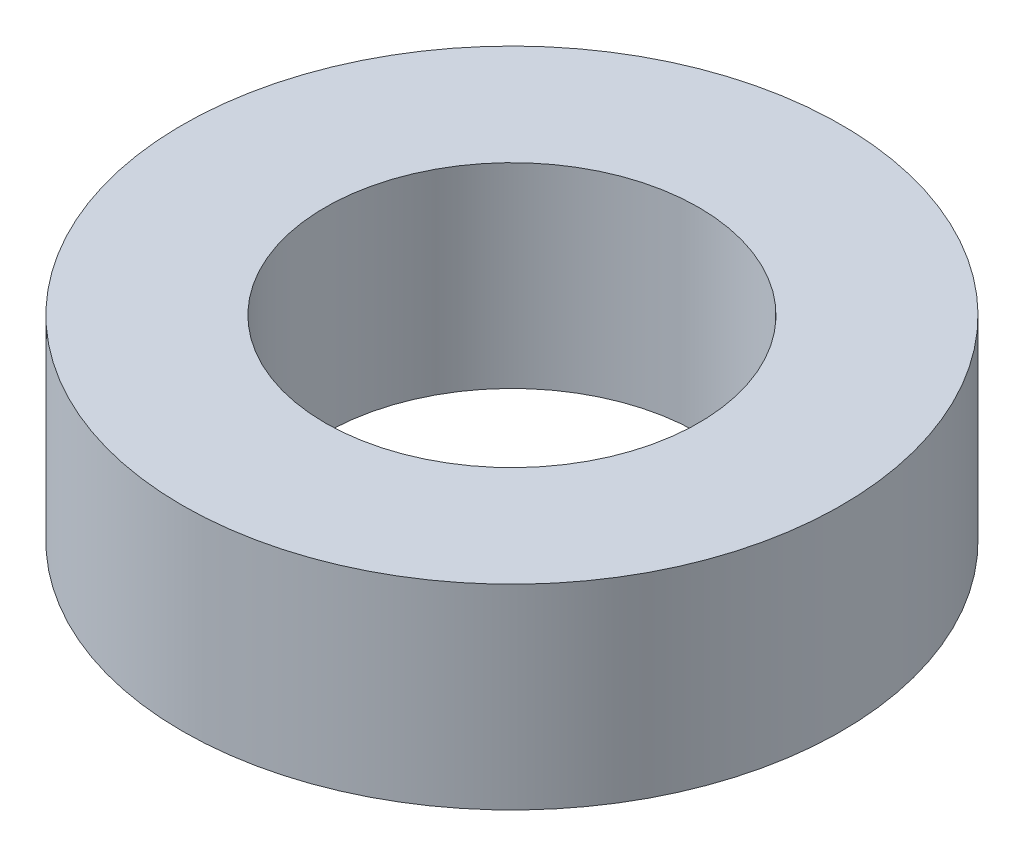
ISO-10303-21;
HEADER;
FILE_DESCRIPTION(('STEP AP214'),'2;1');
FILE_NAME('part.step','',(''),(''),'','','');
FILE_SCHEMA(('AUTOMOTIVE_DESIGN { 1 0 10303 214 1 1 1 1 }'));
ENDSEC;
DATA;
#1=APPLICATION_CONTEXT('core data for automotive mechanical design processes');
#2=APPLICATION_PROTOCOL_DEFINITION('international standard','automotive_design',2000,#1);
#3=PRODUCT_CONTEXT('',#1,'mechanical');
#4=PRODUCT('Part','Part','',(#3));
#5=PRODUCT_RELATED_PRODUCT_CATEGORY('part','',(#4));
#6=PRODUCT_DEFINITION_FORMATION('','',#4);
#7=PRODUCT_DEFINITION_CONTEXT('part definition',#1,'design');
#8=PRODUCT_DEFINITION('design','',#6,#7);
#9=PRODUCT_DEFINITION_SHAPE('','',#8);
#10=(LENGTH_UNIT() NAMED_UNIT(*) SI_UNIT(.MILLI.,.METRE.));
#11=(NAMED_UNIT(*) PLANE_ANGLE_UNIT() SI_UNIT($,.RADIAN.));
#12=(NAMED_UNIT(*) SI_UNIT($,.STERADIAN.) SOLID_ANGLE_UNIT());
#13=UNCERTAINTY_MEASURE_WITH_UNIT(LENGTH_MEASURE(1.E-05),#10,'distance_accuracy_value','');
#14=(GEOMETRIC_REPRESENTATION_CONTEXT(3) GLOBAL_UNCERTAINTY_ASSIGNED_CONTEXT((#13)) GLOBAL_UNIT_ASSIGNED_CONTEXT((#10,
#11,#12)) REPRESENTATION_CONTEXT('',''));
#15=CARTESIAN_POINT('',(0.,0.,0.));
#16=DIRECTION('',(0.,0.,1.));
#17=DIRECTION('',(1.,0.,0.));
#18=AXIS2_PLACEMENT_3D('',#15,#16,#17);
#19=CARTESIAN_POINT('',(0.,8.9,0.));
#20=DIRECTION('',(0.,1.,0.));
#21=DIRECTION('',(0.,0.,1.));
#22=AXIS2_PLACEMENT_3D('',#19,#20,#21);
#23=PLANE('',#22);
#24=CARTESIAN_POINT('',(0.,8.9,0.));
#25=DIRECTION('',(0.,1.,0.));
#26=DIRECTION('',(0.,0.,1.));
#27=AXIS2_PLACEMENT_3D('',#24,#25,#26);
#28=CIRCLE('',#27,15.);
#29=CARTESIAN_POINT('',(0.,8.9,15.));
#30=VERTEX_POINT('',#29);
#31=EDGE_CURVE('E10',#30,#30,#28,.T.);
#32=ORIENTED_EDGE('',*,*,#31,.T.);
#33=EDGE_LOOP('',(#32));
#34=FACE_BOUND('',#33,.T.);
#35=CARTESIAN_POINT('',(0.,8.9,0.));
#36=DIRECTION('',(0.,1.,0.));
#37=DIRECTION('',(0.,0.,1.));
#38=AXIS2_PLACEMENT_3D('',#35,#36,#37);
#39=CIRCLE('',#38,8.5);
#40=CARTESIAN_POINT('',(0.,8.9,8.5));
#41=VERTEX_POINT('',#40);
#42=EDGE_CURVE('E40',#41,#41,#39,.T.);
#43=ORIENTED_EDGE('',*,*,#42,.F.);
#44=EDGE_LOOP('',(#43));
#45=FACE_BOUND('',#44,.T.);
#46=ADVANCED_FACE('F29',(#34,#45),#23,.T.);
#47=CARTESIAN_POINT('',(0.,0.,0.));
#48=DIRECTION('',(0.,1.,0.));
#49=DIRECTION('',(0.,0.,1.));
#50=AXIS2_PLACEMENT_3D('',#47,#48,#49);
#51=PLANE('',#50);
#52=CARTESIAN_POINT('',(0.,0.,0.));
#53=DIRECTION('',(0.,1.,0.));
#54=DIRECTION('',(0.,0.,1.));
#55=AXIS2_PLACEMENT_3D('',#52,#53,#54);
#56=CIRCLE('',#55,15.);
#57=CARTESIAN_POINT('',(0.,0.,15.));
#58=VERTEX_POINT('',#57);
#59=EDGE_CURVE('E33',#58,#58,#56,.T.);
#60=ORIENTED_EDGE('',*,*,#59,.F.);
#61=EDGE_LOOP('',(#60));
#62=FACE_BOUND('',#61,.T.);
#63=CARTESIAN_POINT('',(0.,0.,0.));
#64=DIRECTION('',(0.,1.,0.));
#65=DIRECTION('',(0.,0.,1.));
#66=AXIS2_PLACEMENT_3D('',#63,#64,#65);
#67=CIRCLE('',#66,8.5);
#68=CARTESIAN_POINT('',(0.,0.,8.5));
#69=VERTEX_POINT('',#68);
#70=EDGE_CURVE('E42',#69,#69,#67,.T.);
#71=ORIENTED_EDGE('',*,*,#70,.T.);
#72=EDGE_LOOP('',(#71));
#73=FACE_BOUND('',#72,.T.);
#74=ADVANCED_FACE('F52',(#62,#73),#51,.F.);
#75=CARTESIAN_POINT('',(0.,8.9,0.));
#76=DIRECTION('',(0.,-1.,0.));
#77=DIRECTION('',(0.,0.,-1.));
#78=AXIS2_PLACEMENT_3D('',#75,#76,#77);
#79=CYLINDRICAL_SURFACE('',#78,15.);
#80=ORIENTED_EDGE('',*,*,#31,.F.);
#81=EDGE_LOOP('',(#80));
#82=FACE_BOUND('',#81,.T.);
#83=ORIENTED_EDGE('',*,*,#59,.T.);
#84=EDGE_LOOP('',(#83));
#85=FACE_BOUND('',#84,.T.);
#86=ADVANCED_FACE('F31',(#82,#85),#79,.T.);
#87=CARTESIAN_POINT('',(0.,8.9,0.));
#88=DIRECTION('',(0.,-1.,0.));
#89=DIRECTION('',(0.,0.,-1.));
#90=AXIS2_PLACEMENT_3D('',#87,#88,#89);
#91=CYLINDRICAL_SURFACE('',#90,8.5);
#92=ORIENTED_EDGE('',*,*,#42,.T.);
#93=EDGE_LOOP('',(#92));
#94=FACE_BOUND('',#93,.T.);
#95=ORIENTED_EDGE('',*,*,#70,.F.);
#96=EDGE_LOOP('',(#95));
#97=FACE_BOUND('',#96,.T.);
#98=ADVANCED_FACE('F48',(#94,#97),#91,.F.);
#99=CLOSED_SHELL('',(#46,#74,#86,#98));
#100=MANIFOLD_SOLID_BREP('B2',#99);
#101=ADVANCED_BREP_SHAPE_REPRESENTATION('',(#18,#100),#14);
#102=SHAPE_DEFINITION_REPRESENTATION(#9,#101);
ENDSEC;
END-ISO-10303-21;
